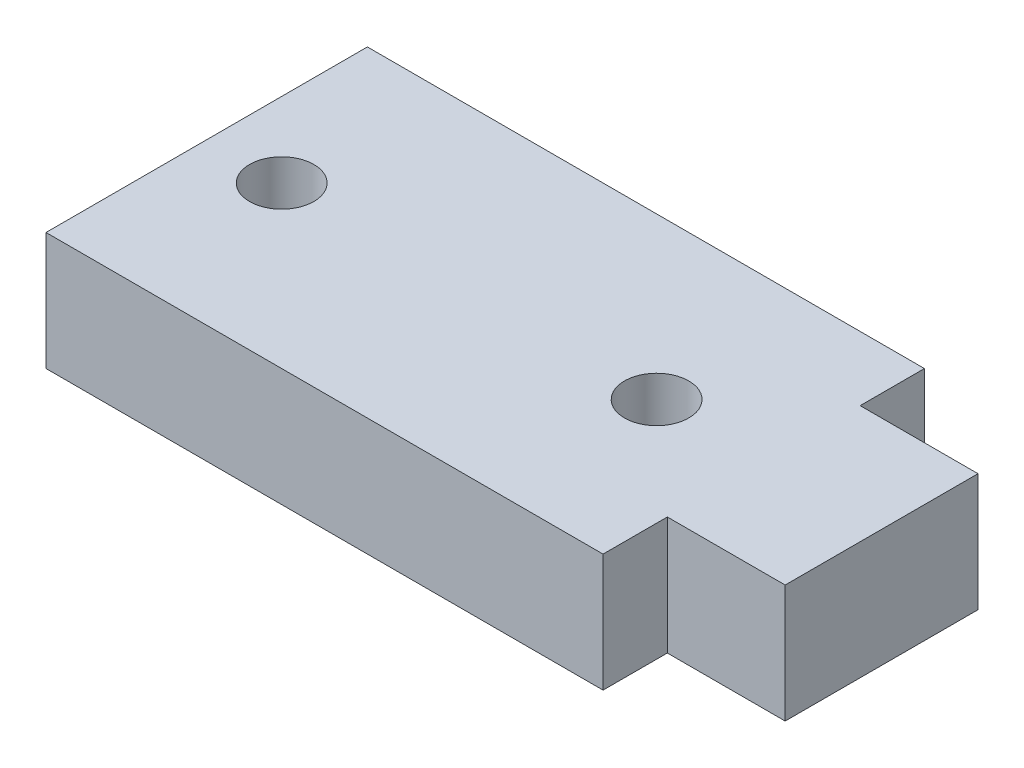
ISO-10303-21;
HEADER;
FILE_DESCRIPTION(('STEP AP214'),'2;1');
FILE_NAME('part.step','',(''),(''),'','','');
FILE_SCHEMA(('AUTOMOTIVE_DESIGN { 1 0 10303 214 1 1 1 1 }'));
ENDSEC;
DATA;
#1=APPLICATION_CONTEXT('core data for automotive mechanical design processes');
#2=APPLICATION_PROTOCOL_DEFINITION('international standard','automotive_design',2000,#1);
#3=PRODUCT_CONTEXT('',#1,'mechanical');
#4=PRODUCT('Part','Part','',(#3));
#5=PRODUCT_RELATED_PRODUCT_CATEGORY('part','',(#4));
#6=PRODUCT_DEFINITION_FORMATION('','',#4);
#7=PRODUCT_DEFINITION_CONTEXT('part definition',#1,'design');
#8=PRODUCT_DEFINITION('design','',#6,#7);
#9=PRODUCT_DEFINITION_SHAPE('','',#8);
#10=(LENGTH_UNIT() NAMED_UNIT(*) SI_UNIT(.MILLI.,.METRE.));
#11=(NAMED_UNIT(*) PLANE_ANGLE_UNIT() SI_UNIT($,.RADIAN.));
#12=(NAMED_UNIT(*) SI_UNIT($,.STERADIAN.) SOLID_ANGLE_UNIT());
#13=UNCERTAINTY_MEASURE_WITH_UNIT(LENGTH_MEASURE(1.E-05),#10,'distance_accuracy_value','');
#14=(GEOMETRIC_REPRESENTATION_CONTEXT(3) GLOBAL_UNCERTAINTY_ASSIGNED_CONTEXT((#13)) GLOBAL_UNIT_ASSIGNED_CONTEXT((#10,
#11,#12)) REPRESENTATION_CONTEXT('',''));
#15=CARTESIAN_POINT('',(0.,0.,0.));
#16=DIRECTION('',(0.,0.,1.));
#17=DIRECTION('',(1.,0.,0.));
#18=AXIS2_PLACEMENT_3D('',#15,#16,#17);
#19=CARTESIAN_POINT('',(0.,5.5,0.));
#20=DIRECTION('',(0.,1.,0.));
#21=DIRECTION('',(0.,0.,1.));
#22=AXIS2_PLACEMENT_3D('',#19,#20,#21);
#23=PLANE('',#22);
#24=CARTESIAN_POINT('',(-66.8181818181818,5.5,-2.20454545454545));
#25=DIRECTION('',(0.,1.,0.));
#26=DIRECTION('',(0.,0.,1.));
#27=AXIS2_PLACEMENT_3D('',#24,#25,#26);
#28=CIRCLE('',#27,1.5);
#29=CARTESIAN_POINT('',(-66.8181818181818,5.5,-0.704545454545455));
#30=VERTEX_POINT('',#29);
#31=EDGE_CURVE('E135',#30,#30,#28,.T.);
#32=ORIENTED_EDGE('',*,*,#31,.F.);
#33=EDGE_LOOP('',(#32));
#34=FACE_BOUND('',#33,.T.);
#35=DIRECTION('',(0.,0.,1.));
#36=VECTOR('',#35,1.);
#37=CARTESIAN_POINT('',(-70.3181818181818,5.5,-9.70454545454545));
#38=LINE('',#37,#36);
#39=CARTESIAN_POINT('',(-70.3181818181818,5.5,-9.70454545454545));
#40=VERTEX_POINT('',#39);
#41=CARTESIAN_POINT('',(-70.3181818181818,5.5,5.29545454545455));
#42=VERTEX_POINT('',#41);
#43=EDGE_CURVE('E146',#40,#42,#38,.T.);
#44=ORIENTED_EDGE('',*,*,#43,.T.);
#45=DIRECTION('',(1.,0.,0.));
#46=VECTOR('',#45,1.);
#47=CARTESIAN_POINT('',(-70.3181818181818,5.5,5.29545454545455));
#48=LINE('',#47,#46);
#49=CARTESIAN_POINT('',(-44.3181818181818,5.5,5.29545454545454));
#50=VERTEX_POINT('',#49);
#51=EDGE_CURVE('E94',#42,#50,#48,.T.);
#52=ORIENTED_EDGE('',*,*,#51,.T.);
#53=DIRECTION('',(0.,0.,-1.));
#54=VECTOR('',#53,1.);
#55=CARTESIAN_POINT('',(-44.3181818181818,5.5,5.29545454545454));
#56=LINE('',#55,#54);
#57=CARTESIAN_POINT('',(-44.3181818181818,5.5,2.29545454545454));
#58=VERTEX_POINT('',#57);
#59=EDGE_CURVE('E161',#50,#58,#56,.T.);
#60=ORIENTED_EDGE('',*,*,#59,.T.);
#61=DIRECTION('',(1.,0.,0.));
#62=VECTOR('',#61,1.);
#63=CARTESIAN_POINT('',(-44.3181818181818,5.5,2.29545454545454));
#64=LINE('',#63,#62);
#65=CARTESIAN_POINT('',(-38.8181818181818,5.5,2.29545454545454));
#66=VERTEX_POINT('',#65);
#67=EDGE_CURVE('E174',#58,#66,#64,.T.);
#68=ORIENTED_EDGE('',*,*,#67,.T.);
#69=DIRECTION('',(0.,0.,-1.));
#70=VECTOR('',#69,1.);
#71=CARTESIAN_POINT('',(-38.8181818181818,5.5,-6.70454545454545));
#72=LINE('',#71,#70);
#73=CARTESIAN_POINT('',(-38.8181818181818,5.5,-6.70454545454545));
#74=VERTEX_POINT('',#73);
#75=EDGE_CURVE('E113',#66,#74,#72,.T.);
#76=ORIENTED_EDGE('',*,*,#75,.T.);
#77=DIRECTION('',(-1.,0.,0.));
#78=VECTOR('',#77,1.);
#79=CARTESIAN_POINT('',(-44.3181818181818,5.5,-6.70454545454545));
#80=LINE('',#79,#78);
#81=CARTESIAN_POINT('',(-44.3181818181818,5.5,-6.70454545454545));
#82=VERTEX_POINT('',#81);
#83=EDGE_CURVE('E107',#74,#82,#80,.T.);
#84=ORIENTED_EDGE('',*,*,#83,.T.);
#85=DIRECTION('',(0.,0.,-1.));
#86=VECTOR('',#85,1.);
#87=CARTESIAN_POINT('',(-44.3181818181818,5.5,-9.70454545454545));
#88=LINE('',#87,#86);
#89=CARTESIAN_POINT('',(-44.3181818181818,5.5,-9.70454545454545));
#90=VERTEX_POINT('',#89);
#91=EDGE_CURVE('E111',#82,#90,#88,.T.);
#92=ORIENTED_EDGE('',*,*,#91,.T.);
#93=DIRECTION('',(-1.,0.,0.));
#94=VECTOR('',#93,1.);
#95=CARTESIAN_POINT('',(-70.3181818181818,5.5,-9.70454545454545));
#96=LINE('',#95,#94);
#97=EDGE_CURVE('E51',#90,#40,#96,.T.);
#98=ORIENTED_EDGE('',*,*,#97,.T.);
#99=EDGE_LOOP('',(#44,#52,#60,#68,#76,#84,#92,#98));
#100=FACE_BOUND('',#99,.T.);
#101=CARTESIAN_POINT('',(-49.3181818181818,5.5,-2.20454545454545));
#102=DIRECTION('',(0.,1.,0.));
#103=DIRECTION('',(0.,0.,1.));
#104=AXIS2_PLACEMENT_3D('',#101,#102,#103);
#105=CIRCLE('',#104,1.5);
#106=CARTESIAN_POINT('',(-49.3181818181818,5.5,-0.704545454545448));
#107=VERTEX_POINT('',#106);
#108=EDGE_CURVE('E183',#107,#107,#105,.T.);
#109=ORIENTED_EDGE('',*,*,#108,.F.);
#110=EDGE_LOOP('',(#109));
#111=FACE_BOUND('',#110,.T.);
#112=ADVANCED_FACE('F34',(#34,#100,#111),#23,.T.);
#113=CARTESIAN_POINT('',(0.,0.,0.));
#114=DIRECTION('',(0.,1.,0.));
#115=DIRECTION('',(0.,0.,1.));
#116=AXIS2_PLACEMENT_3D('',#113,#114,#115);
#117=PLANE('',#116);
#118=DIRECTION('',(0.,0.,1.));
#119=VECTOR('',#118,1.);
#120=CARTESIAN_POINT('',(-70.3181818181818,0.,-9.70454545454545));
#121=LINE('',#120,#119);
#122=CARTESIAN_POINT('',(-70.3181818181818,0.,-9.70454545454545));
#123=VERTEX_POINT('',#122);
#124=CARTESIAN_POINT('',(-70.3181818181818,0.,5.29545454545455));
#125=VERTEX_POINT('',#124);
#126=EDGE_CURVE('E131',#123,#125,#121,.T.);
#127=ORIENTED_EDGE('',*,*,#126,.F.);
#128=DIRECTION('',(-1.,0.,0.));
#129=VECTOR('',#128,1.);
#130=CARTESIAN_POINT('',(-70.3181818181818,0.,-9.70454545454545));
#131=LINE('',#130,#129);
#132=CARTESIAN_POINT('',(-44.3181818181818,0.,-9.70454545454545));
#133=VERTEX_POINT('',#132);
#134=EDGE_CURVE('E86',#133,#123,#131,.T.);
#135=ORIENTED_EDGE('',*,*,#134,.F.);
#136=DIRECTION('',(0.,0.,-1.));
#137=VECTOR('',#136,1.);
#138=CARTESIAN_POINT('',(-44.3181818181818,0.,-9.70454545454545));
#139=LINE('',#138,#137);
#140=CARTESIAN_POINT('',(-44.3181818181818,0.,-6.70454545454545));
#141=VERTEX_POINT('',#140);
#142=EDGE_CURVE('E80',#141,#133,#139,.T.);
#143=ORIENTED_EDGE('',*,*,#142,.F.);
#144=DIRECTION('',(-1.,0.,0.));
#145=VECTOR('',#144,1.);
#146=CARTESIAN_POINT('',(-44.3181818181818,0.,-6.70454545454545));
#147=LINE('',#146,#145);
#148=CARTESIAN_POINT('',(-38.8181818181818,0.,-6.70454545454545));
#149=VERTEX_POINT('',#148);
#150=EDGE_CURVE('E121',#149,#141,#147,.T.);
#151=ORIENTED_EDGE('',*,*,#150,.F.);
#152=DIRECTION('',(0.,0.,-1.));
#153=VECTOR('',#152,1.);
#154=CARTESIAN_POINT('',(-38.8181818181818,0.,-6.70454545454545));
#155=LINE('',#154,#153);
#156=CARTESIAN_POINT('',(-38.8181818181818,0.,2.29545454545454));
#157=VERTEX_POINT('',#156);
#158=EDGE_CURVE('E141',#157,#149,#155,.T.);
#159=ORIENTED_EDGE('',*,*,#158,.F.);
#160=DIRECTION('',(1.,0.,0.));
#161=VECTOR('',#160,1.);
#162=CARTESIAN_POINT('',(-44.3181818181818,0.,2.29545454545454));
#163=LINE('',#162,#161);
#164=CARTESIAN_POINT('',(-44.3181818181818,0.,2.29545454545454));
#165=VERTEX_POINT('',#164);
#166=EDGE_CURVE('E139',#165,#157,#163,.T.);
#167=ORIENTED_EDGE('',*,*,#166,.F.);
#168=DIRECTION('',(0.,0.,-1.));
#169=VECTOR('',#168,1.);
#170=CARTESIAN_POINT('',(-44.3181818181818,0.,5.29545454545454));
#171=LINE('',#170,#169);
#172=CARTESIAN_POINT('',(-44.3181818181818,0.,5.29545454545454));
#173=VERTEX_POINT('',#172);
#174=EDGE_CURVE('E137',#173,#165,#171,.T.);
#175=ORIENTED_EDGE('',*,*,#174,.F.);
#176=DIRECTION('',(1.,0.,0.));
#177=VECTOR('',#176,1.);
#178=CARTESIAN_POINT('',(-70.3181818181818,0.,5.29545454545455));
#179=LINE('',#178,#177);
#180=EDGE_CURVE('E134',#125,#173,#179,.T.);
#181=ORIENTED_EDGE('',*,*,#180,.F.);
#182=EDGE_LOOP('',(#127,#135,#143,#151,#159,#167,#175,#181));
#183=FACE_BOUND('',#182,.T.);
#184=CARTESIAN_POINT('',(-66.8181818181818,0.,-2.20454545454545));
#185=DIRECTION('',(0.,1.,0.));
#186=DIRECTION('',(0.,0.,1.));
#187=AXIS2_PLACEMENT_3D('',#184,#185,#186);
#188=CIRCLE('',#187,1.5);
#189=CARTESIAN_POINT('',(-66.8181818181818,0.,-0.704545454545455));
#190=VERTEX_POINT('',#189);
#191=EDGE_CURVE('E180',#190,#190,#188,.T.);
#192=ORIENTED_EDGE('',*,*,#191,.T.);
#193=EDGE_LOOP('',(#192));
#194=FACE_BOUND('',#193,.T.);
#195=CARTESIAN_POINT('',(-49.3181818181818,0.,-2.20454545454545));
#196=DIRECTION('',(0.,1.,0.));
#197=DIRECTION('',(0.,0.,1.));
#198=AXIS2_PLACEMENT_3D('',#195,#196,#197);
#199=CIRCLE('',#198,1.5);
#200=CARTESIAN_POINT('',(-49.3181818181818,0.,-0.704545454545448));
#201=VERTEX_POINT('',#200);
#202=EDGE_CURVE('E186',#201,#201,#199,.T.);
#203=ORIENTED_EDGE('',*,*,#202,.T.);
#204=EDGE_LOOP('',(#203));
#205=FACE_BOUND('',#204,.T.);
#206=ADVANCED_FACE('F165',(#183,#194,#205),#117,.F.);
#207=CARTESIAN_POINT('',(-70.3181818181818,5.5,-9.70454545454545));
#208=DIRECTION('',(1.,0.,0.));
#209=DIRECTION('',(0.,0.,-1.));
#210=AXIS2_PLACEMENT_3D('',#207,#208,#209);
#211=PLANE('',#210);
#212=ORIENTED_EDGE('',*,*,#126,.T.);
#213=DIRECTION('',(0.,-1.,0.));
#214=VECTOR('',#213,1.);
#215=CARTESIAN_POINT('',(-70.3181818181818,5.5,5.29545454545455));
#216=LINE('',#215,#214);
#217=EDGE_CURVE('E11',#42,#125,#216,.T.);
#218=ORIENTED_EDGE('',*,*,#217,.F.);
#219=ORIENTED_EDGE('',*,*,#43,.F.);
#220=DIRECTION('',(0.,-1.,0.));
#221=VECTOR('',#220,1.);
#222=CARTESIAN_POINT('',(-70.3181818181818,5.5,-9.70454545454545));
#223=LINE('',#222,#221);
#224=EDGE_CURVE('E127',#40,#123,#223,.T.);
#225=ORIENTED_EDGE('',*,*,#224,.T.);
#226=EDGE_LOOP('',(#212,#218,#219,#225));
#227=FACE_BOUND('',#226,.T.);
#228=ADVANCED_FACE('F36',(#227),#211,.F.);
#229=CARTESIAN_POINT('',(-70.3181818181818,5.5,5.29545454545455));
#230=DIRECTION('',(0.,0.,-1.));
#231=DIRECTION('',(-1.,0.,0.));
#232=AXIS2_PLACEMENT_3D('',#229,#230,#231);
#233=PLANE('',#232);
#234=ORIENTED_EDGE('',*,*,#180,.T.);
#235=DIRECTION('',(0.,-1.,0.));
#236=VECTOR('',#235,1.);
#237=CARTESIAN_POINT('',(-44.3181818181818,5.5,5.29545454545454));
#238=LINE('',#237,#236);
#239=EDGE_CURVE('E43',#50,#173,#238,.T.);
#240=ORIENTED_EDGE('',*,*,#239,.F.);
#241=ORIENTED_EDGE('',*,*,#51,.F.);
#242=ORIENTED_EDGE('',*,*,#217,.T.);
#243=EDGE_LOOP('',(#234,#240,#241,#242));
#244=FACE_BOUND('',#243,.T.);
#245=ADVANCED_FACE('F218',(#244),#233,.F.);
#246=CARTESIAN_POINT('',(-44.3181818181818,5.5,5.29545454545454));
#247=DIRECTION('',(-1.,0.,0.));
#248=DIRECTION('',(0.,0.,1.));
#249=AXIS2_PLACEMENT_3D('',#246,#247,#248);
#250=PLANE('',#249);
#251=ORIENTED_EDGE('',*,*,#174,.T.);
#252=DIRECTION('',(0.,-1.,0.));
#253=VECTOR('',#252,1.);
#254=CARTESIAN_POINT('',(-44.3181818181818,5.5,2.29545454545454));
#255=LINE('',#254,#253);
#256=EDGE_CURVE('E153',#58,#165,#255,.T.);
#257=ORIENTED_EDGE('',*,*,#256,.F.);
#258=ORIENTED_EDGE('',*,*,#59,.F.);
#259=ORIENTED_EDGE('',*,*,#239,.T.);
#260=EDGE_LOOP('',(#251,#257,#258,#259));
#261=FACE_BOUND('',#260,.T.);
#262=ADVANCED_FACE('F159',(#261),#250,.F.);
#263=CARTESIAN_POINT('',(-44.3181818181818,5.5,2.29545454545454));
#264=DIRECTION('',(0.,0.,-1.));
#265=DIRECTION('',(-1.,0.,0.));
#266=AXIS2_PLACEMENT_3D('',#263,#264,#265);
#267=PLANE('',#266);
#268=ORIENTED_EDGE('',*,*,#166,.T.);
#269=DIRECTION('',(0.,-1.,0.));
#270=VECTOR('',#269,1.);
#271=CARTESIAN_POINT('',(-38.8181818181818,5.5,2.29545454545454));
#272=LINE('',#271,#270);
#273=EDGE_CURVE('E150',#66,#157,#272,.T.);
#274=ORIENTED_EDGE('',*,*,#273,.F.);
#275=ORIENTED_EDGE('',*,*,#67,.F.);
#276=ORIENTED_EDGE('',*,*,#256,.T.);
#277=EDGE_LOOP('',(#268,#274,#275,#276));
#278=FACE_BOUND('',#277,.T.);
#279=ADVANCED_FACE('F170',(#278),#267,.F.);
#280=CARTESIAN_POINT('',(-38.8181818181818,5.5,-6.70454545454545));
#281=DIRECTION('',(-1.,0.,0.));
#282=DIRECTION('',(0.,0.,1.));
#283=AXIS2_PLACEMENT_3D('',#280,#281,#282);
#284=PLANE('',#283);
#285=ORIENTED_EDGE('',*,*,#158,.T.);
#286=DIRECTION('',(0.,-1.,0.));
#287=VECTOR('',#286,1.);
#288=CARTESIAN_POINT('',(-38.8181818181818,5.5,-6.70454545454545));
#289=LINE('',#288,#287);
#290=EDGE_CURVE('E122',#74,#149,#289,.T.);
#291=ORIENTED_EDGE('',*,*,#290,.F.);
#292=ORIENTED_EDGE('',*,*,#75,.F.);
#293=ORIENTED_EDGE('',*,*,#273,.T.);
#294=EDGE_LOOP('',(#285,#291,#292,#293));
#295=FACE_BOUND('',#294,.T.);
#296=ADVANCED_FACE('F173',(#295),#284,.F.);
#297=CARTESIAN_POINT('',(-44.3181818181818,5.5,-6.70454545454545));
#298=DIRECTION('',(0.,0.,1.));
#299=DIRECTION('',(1.,0.,0.));
#300=AXIS2_PLACEMENT_3D('',#297,#298,#299);
#301=PLANE('',#300);
#302=ORIENTED_EDGE('',*,*,#150,.T.);
#303=DIRECTION('',(0.,-1.,0.));
#304=VECTOR('',#303,1.);
#305=CARTESIAN_POINT('',(-44.3181818181818,5.5,-6.70454545454545));
#306=LINE('',#305,#304);
#307=EDGE_CURVE('E118',#82,#141,#306,.T.);
#308=ORIENTED_EDGE('',*,*,#307,.F.);
#309=ORIENTED_EDGE('',*,*,#83,.F.);
#310=ORIENTED_EDGE('',*,*,#290,.T.);
#311=EDGE_LOOP('',(#302,#308,#309,#310));
#312=FACE_BOUND('',#311,.T.);
#313=ADVANCED_FACE('F119',(#312),#301,.F.);
#314=CARTESIAN_POINT('',(-44.3181818181818,5.5,-9.70454545454545));
#315=DIRECTION('',(-1.,0.,0.));
#316=DIRECTION('',(0.,0.,1.));
#317=AXIS2_PLACEMENT_3D('',#314,#315,#316);
#318=PLANE('',#317);
#319=ORIENTED_EDGE('',*,*,#142,.T.);
#320=DIRECTION('',(0.,-1.,0.));
#321=VECTOR('',#320,1.);
#322=CARTESIAN_POINT('',(-44.3181818181818,5.5,-9.70454545454545));
#323=LINE('',#322,#321);
#324=EDGE_CURVE('E123',#90,#133,#323,.T.);
#325=ORIENTED_EDGE('',*,*,#324,.F.);
#326=ORIENTED_EDGE('',*,*,#91,.F.);
#327=ORIENTED_EDGE('',*,*,#307,.T.);
#328=EDGE_LOOP('',(#319,#325,#326,#327));
#329=FACE_BOUND('',#328,.T.);
#330=ADVANCED_FACE('F125',(#329),#318,.F.);
#331=CARTESIAN_POINT('',(-70.3181818181818,5.5,-9.70454545454545));
#332=DIRECTION('',(0.,0.,1.));
#333=DIRECTION('',(1.,0.,0.));
#334=AXIS2_PLACEMENT_3D('',#331,#332,#333);
#335=PLANE('',#334);
#336=ORIENTED_EDGE('',*,*,#134,.T.);
#337=ORIENTED_EDGE('',*,*,#224,.F.);
#338=ORIENTED_EDGE('',*,*,#97,.F.);
#339=ORIENTED_EDGE('',*,*,#324,.T.);
#340=EDGE_LOOP('',(#336,#337,#338,#339));
#341=FACE_BOUND('',#340,.T.);
#342=ADVANCED_FACE('F206',(#341),#335,.F.);
#343=CARTESIAN_POINT('',(-66.8181818181818,5.5,-2.20454545454545));
#344=DIRECTION('',(0.,-1.,0.));
#345=DIRECTION('',(0.,0.,-1.));
#346=AXIS2_PLACEMENT_3D('',#343,#344,#345);
#347=CYLINDRICAL_SURFACE('',#346,1.5);
#348=ORIENTED_EDGE('',*,*,#31,.T.);
#349=EDGE_LOOP('',(#348));
#350=FACE_BOUND('',#349,.T.);
#351=ORIENTED_EDGE('',*,*,#191,.F.);
#352=EDGE_LOOP('',(#351));
#353=FACE_BOUND('',#352,.T.);
#354=ADVANCED_FACE('F203',(#350,#353),#347,.F.);
#355=CARTESIAN_POINT('',(-49.3181818181818,5.5,-2.20454545454545));
#356=DIRECTION('',(0.,-1.,0.));
#357=DIRECTION('',(0.,0.,-1.));
#358=AXIS2_PLACEMENT_3D('',#355,#356,#357);
#359=CYLINDRICAL_SURFACE('',#358,1.5);
#360=ORIENTED_EDGE('',*,*,#108,.T.);
#361=EDGE_LOOP('',(#360));
#362=FACE_BOUND('',#361,.T.);
#363=ORIENTED_EDGE('',*,*,#202,.F.);
#364=EDGE_LOOP('',(#363));
#365=FACE_BOUND('',#364,.T.);
#366=ADVANCED_FACE('F192',(#362,#365),#359,.F.);
#367=CLOSED_SHELL('',(#112,#206,#228,#245,#262,#279,#296,#313,#330,#342,#354,#366));
#368=MANIFOLD_SOLID_BREP('B2',#367);
#369=ADVANCED_BREP_SHAPE_REPRESENTATION('',(#18,#368),#14);
#370=SHAPE_DEFINITION_REPRESENTATION(#9,#369);
ENDSEC;
END-ISO-10303-21;
